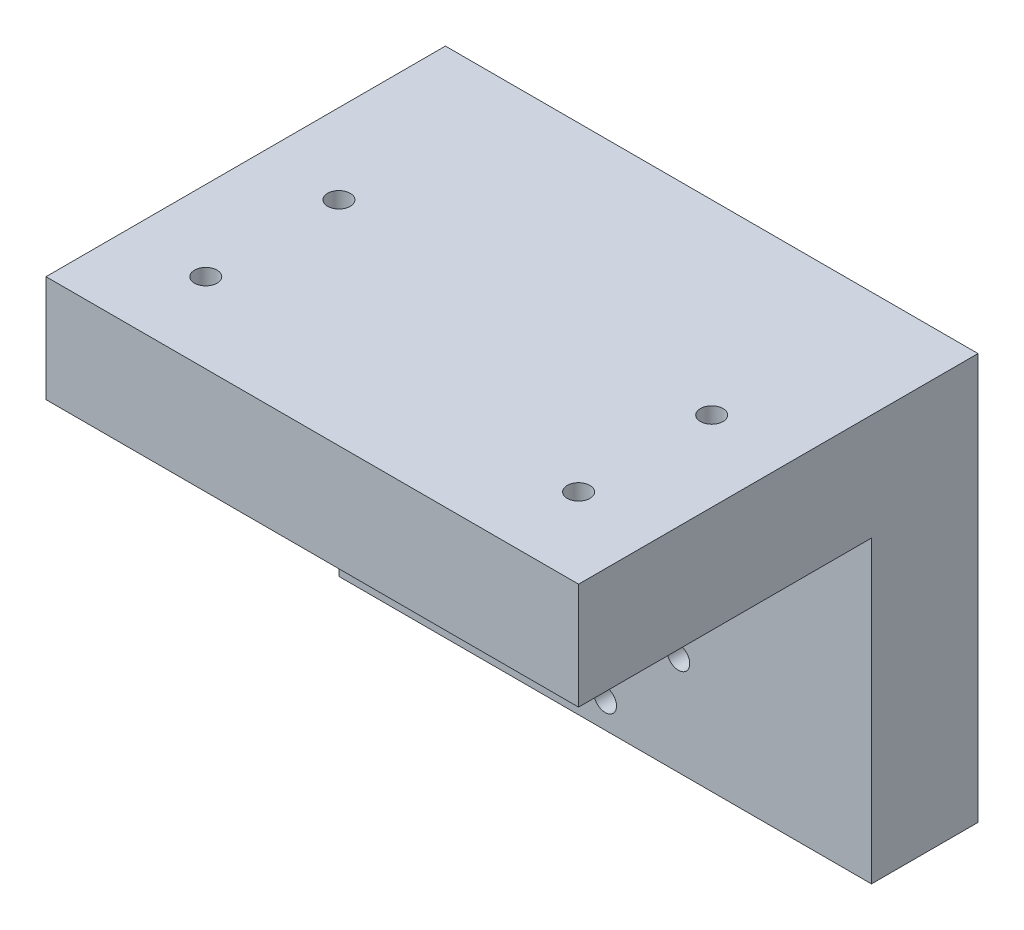
ISO-10303-21;
HEADER;
FILE_DESCRIPTION(('STEP AP214'),'2;1');
FILE_NAME('part.step','',(''),(''),'','','');
FILE_SCHEMA(('AUTOMOTIVE_DESIGN { 1 0 10303 214 1 1 1 1 }'));
ENDSEC;
DATA;
#1=APPLICATION_CONTEXT('core data for automotive mechanical design processes');
#2=APPLICATION_PROTOCOL_DEFINITION('international standard','automotive_design',2000,#1);
#3=PRODUCT_CONTEXT('',#1,'mechanical');
#4=PRODUCT('Part','Part','',(#3));
#5=PRODUCT_RELATED_PRODUCT_CATEGORY('part','',(#4));
#6=PRODUCT_DEFINITION_FORMATION('','',#4);
#7=PRODUCT_DEFINITION_CONTEXT('part definition',#1,'design');
#8=PRODUCT_DEFINITION('design','',#6,#7);
#9=PRODUCT_DEFINITION_SHAPE('','',#8);
#10=(LENGTH_UNIT() NAMED_UNIT(*) SI_UNIT(.MILLI.,.METRE.));
#11=(NAMED_UNIT(*) PLANE_ANGLE_UNIT() SI_UNIT($,.RADIAN.));
#12=(NAMED_UNIT(*) SI_UNIT($,.STERADIAN.) SOLID_ANGLE_UNIT());
#13=UNCERTAINTY_MEASURE_WITH_UNIT(LENGTH_MEASURE(1.E-05),#10,'distance_accuracy_value','');
#14=(GEOMETRIC_REPRESENTATION_CONTEXT(3) GLOBAL_UNCERTAINTY_ASSIGNED_CONTEXT((#13)) GLOBAL_UNIT_ASSIGNED_CONTEXT((#10,
#11,#12)) REPRESENTATION_CONTEXT('',''));
#15=CARTESIAN_POINT('',(0.,0.,0.));
#16=DIRECTION('',(0.,0.,1.));
#17=DIRECTION('',(1.,0.,0.));
#18=AXIS2_PLACEMENT_3D('',#15,#16,#17);
#19=CARTESIAN_POINT('',(40.,-46.,2.));
#20=DIRECTION('',(0.,0.,1.));
#21=DIRECTION('',(1.,0.,0.));
#22=AXIS2_PLACEMENT_3D('',#19,#20,#21);
#23=PLANE('',#22);
#24=CARTESIAN_POINT('',(40.,-46.,2.));
#25=DIRECTION('',(0.,0.,1.));
#26=DIRECTION('',(1.,0.,0.));
#27=AXIS2_PLACEMENT_3D('',#24,#25,#26);
#28=CIRCLE('',#27,4.);
#29=CARTESIAN_POINT('',(44.,-46.,2.));
#30=VERTEX_POINT('',#29);
#31=EDGE_CURVE('E341',#30,#30,#28,.T.);
#32=ORIENTED_EDGE('',*,*,#31,.T.);
#33=EDGE_LOOP('',(#32));
#34=FACE_BOUND('',#33,.T.);
#35=CARTESIAN_POINT('',(40.,-46.,2.));
#36=DIRECTION('',(0.,0.,1.));
#37=DIRECTION('',(1.,0.,0.));
#38=AXIS2_PLACEMENT_3D('',#35,#36,#37);
#39=CIRCLE('',#38,9.1);
#40=CARTESIAN_POINT('',(49.1,-46.,2.));
#41=VERTEX_POINT('',#40);
#42=EDGE_CURVE('E42',#41,#41,#39,.T.);
#43=ORIENTED_EDGE('',*,*,#42,.F.);
#44=EDGE_LOOP('',(#43));
#45=FACE_BOUND('',#44,.T.);
#46=ADVANCED_FACE('F23',(#34,#45),#23,.F.);
#47=CARTESIAN_POINT('',(68.,1.,48.));
#48=DIRECTION('',(0.,-1.,0.));
#49=DIRECTION('',(0.,0.,-1.));
#50=AXIS2_PLACEMENT_3D('',#47,#48,#49);
#51=CYLINDRICAL_SURFACE('',#50,1.7);
#52=DIRECTION('',(0.,-1.,0.));
#53=VECTOR('',#52,1.);
#54=CARTESIAN_POINT('',(68.,1.,46.3));
#55=LINE('',#54,#53);
#56=CARTESIAN_POINT('',(68.,0.,46.3));
#57=VERTEX_POINT('',#56);
#58=CARTESIAN_POINT('',(68.,-16.,46.3));
#59=VERTEX_POINT('',#58);
#60=EDGE_CURVE('E12',#57,#59,#55,.T.);
#61=ORIENTED_EDGE('',*,*,#60,.F.);
#62=CARTESIAN_POINT('',(68.,0.,48.));
#63=DIRECTION('',(0.,-1.,0.));
#64=DIRECTION('',(0.,0.,-1.));
#65=AXIS2_PLACEMENT_3D('',#62,#63,#64);
#66=CIRCLE('',#65,1.7);
#67=EDGE_CURVE('E318',#57,#57,#66,.T.);
#68=ORIENTED_EDGE('',*,*,#67,.F.);
#69=ORIENTED_EDGE('',*,*,#60,.T.);
#70=CARTESIAN_POINT('',(68.,-16.,48.));
#71=DIRECTION('',(0.,-1.,0.));
#72=DIRECTION('',(0.,0.,-1.));
#73=AXIS2_PLACEMENT_3D('',#70,#71,#72);
#74=CIRCLE('',#73,1.7);
#75=EDGE_CURVE('E334',#59,#59,#74,.T.);
#76=ORIENTED_EDGE('',*,*,#75,.T.);
#77=EDGE_LOOP('',(#61,#68,#69,#76));
#78=FACE_BOUND('',#77,.T.);
#79=ADVANCED_FACE('F658',(#78),#51,.F.);
#80=CARTESIAN_POINT('',(68.,1.,28.));
#81=DIRECTION('',(0.,-1.,0.));
#82=DIRECTION('',(0.,0.,-1.));
#83=AXIS2_PLACEMENT_3D('',#80,#81,#82);
#84=CYLINDRICAL_SURFACE('',#83,1.7);
#85=DIRECTION('',(0.,-1.,0.));
#86=VECTOR('',#85,1.);
#87=CARTESIAN_POINT('',(68.,1.,26.3));
#88=LINE('',#87,#86);
#89=CARTESIAN_POINT('',(68.,0.,26.3));
#90=VERTEX_POINT('',#89);
#91=CARTESIAN_POINT('',(68.,-16.,26.3));
#92=VERTEX_POINT('',#91);
#93=EDGE_CURVE('E27',#90,#92,#88,.T.);
#94=ORIENTED_EDGE('',*,*,#93,.F.);
#95=CARTESIAN_POINT('',(68.,0.,28.));
#96=DIRECTION('',(0.,-1.,0.));
#97=DIRECTION('',(0.,0.,-1.));
#98=AXIS2_PLACEMENT_3D('',#95,#96,#97);
#99=CIRCLE('',#98,1.7);
#100=EDGE_CURVE('E314',#90,#90,#99,.T.);
#101=ORIENTED_EDGE('',*,*,#100,.F.);
#102=ORIENTED_EDGE('',*,*,#93,.T.);
#103=CARTESIAN_POINT('',(68.,-16.,28.));
#104=DIRECTION('',(0.,-1.,0.));
#105=DIRECTION('',(0.,0.,-1.));
#106=AXIS2_PLACEMENT_3D('',#103,#104,#105);
#107=CIRCLE('',#106,1.7);
#108=EDGE_CURVE('E328',#92,#92,#107,.T.);
#109=ORIENTED_EDGE('',*,*,#108,.T.);
#110=EDGE_LOOP('',(#94,#101,#102,#109));
#111=FACE_BOUND('',#110,.T.);
#112=ADVANCED_FACE('F647',(#111),#84,.F.);
#113=CARTESIAN_POINT('',(12.,1.,48.));
#114=DIRECTION('',(0.,-1.,0.));
#115=DIRECTION('',(0.,0.,-1.));
#116=AXIS2_PLACEMENT_3D('',#113,#114,#115);
#117=CYLINDRICAL_SURFACE('',#116,1.7);
#118=DIRECTION('',(0.,-1.,0.));
#119=VECTOR('',#118,1.);
#120=CARTESIAN_POINT('',(12.,1.,46.3));
#121=LINE('',#120,#119);
#122=CARTESIAN_POINT('',(12.,0.,46.3));
#123=VERTEX_POINT('',#122);
#124=CARTESIAN_POINT('',(12.,-16.,46.3));
#125=VERTEX_POINT('',#124);
#126=EDGE_CURVE('E228',#123,#125,#121,.T.);
#127=ORIENTED_EDGE('',*,*,#126,.F.);
#128=CARTESIAN_POINT('',(12.,0.,48.));
#129=DIRECTION('',(0.,-1.,0.));
#130=DIRECTION('',(0.,0.,-1.));
#131=AXIS2_PLACEMENT_3D('',#128,#129,#130);
#132=CIRCLE('',#131,1.7);
#133=EDGE_CURVE('E309',#123,#123,#132,.T.);
#134=ORIENTED_EDGE('',*,*,#133,.F.);
#135=ORIENTED_EDGE('',*,*,#126,.T.);
#136=CARTESIAN_POINT('',(12.,-16.,48.));
#137=DIRECTION('',(0.,-1.,0.));
#138=DIRECTION('',(0.,0.,-1.));
#139=AXIS2_PLACEMENT_3D('',#136,#137,#138);
#140=CIRCLE('',#139,1.7);
#141=EDGE_CURVE('E246',#125,#125,#140,.T.);
#142=ORIENTED_EDGE('',*,*,#141,.T.);
#143=EDGE_LOOP('',(#127,#134,#135,#142));
#144=FACE_BOUND('',#143,.T.);
#145=ADVANCED_FACE('F610',(#144),#117,.F.);
#146=CARTESIAN_POINT('',(12.,1.,28.));
#147=DIRECTION('',(0.,-1.,0.));
#148=DIRECTION('',(0.,0.,-1.));
#149=AXIS2_PLACEMENT_3D('',#146,#147,#148);
#150=CYLINDRICAL_SURFACE('',#149,1.7);
#151=DIRECTION('',(0.,-1.,0.));
#152=VECTOR('',#151,1.);
#153=CARTESIAN_POINT('',(12.,1.,26.3));
#154=LINE('',#153,#152);
#155=CARTESIAN_POINT('',(12.,0.,26.3));
#156=VERTEX_POINT('',#155);
#157=CARTESIAN_POINT('',(12.,-16.,26.3));
#158=VERTEX_POINT('',#157);
#159=EDGE_CURVE('E235',#156,#158,#154,.T.);
#160=ORIENTED_EDGE('',*,*,#159,.F.);
#161=CARTESIAN_POINT('',(12.,0.,28.));
#162=DIRECTION('',(0.,-1.,0.));
#163=DIRECTION('',(0.,0.,-1.));
#164=AXIS2_PLACEMENT_3D('',#161,#162,#163);
#165=CIRCLE('',#164,1.7);
#166=EDGE_CURVE('E308',#156,#156,#165,.T.);
#167=ORIENTED_EDGE('',*,*,#166,.F.);
#168=ORIENTED_EDGE('',*,*,#159,.T.);
#169=CARTESIAN_POINT('',(12.,-16.,28.));
#170=DIRECTION('',(0.,-1.,0.));
#171=DIRECTION('',(0.,0.,-1.));
#172=AXIS2_PLACEMENT_3D('',#169,#170,#171);
#173=CIRCLE('',#172,1.7);
#174=EDGE_CURVE('E245',#158,#158,#173,.T.);
#175=ORIENTED_EDGE('',*,*,#174,.T.);
#176=EDGE_LOOP('',(#160,#167,#168,#175));
#177=FACE_BOUND('',#176,.T.);
#178=ADVANCED_FACE('F605',(#177),#150,.F.);
#179=CARTESIAN_POINT('',(40.,-46.,0.));
#180=DIRECTION('',(0.,0.,1.));
#181=DIRECTION('',(1.,0.,0.));
#182=AXIS2_PLACEMENT_3D('',#179,#180,#181);
#183=CYLINDRICAL_SURFACE('',#182,9.1);
#184=DIRECTION('',(0.,0.,1.));
#185=VECTOR('',#184,1.);
#186=CARTESIAN_POINT('',(49.1,-46.,0.));
#187=LINE('',#186,#185);
#188=CARTESIAN_POINT('',(49.1,-46.,0.));
#189=VERTEX_POINT('',#188);
#190=EDGE_CURVE('E348',#189,#41,#187,.T.);
#191=ORIENTED_EDGE('',*,*,#190,.F.);
#192=CARTESIAN_POINT('',(40.,-46.,0.));
#193=DIRECTION('',(0.,0.,1.));
#194=DIRECTION('',(1.,0.,0.));
#195=AXIS2_PLACEMENT_3D('',#192,#193,#194);
#196=CIRCLE('',#195,9.1);
#197=EDGE_CURVE('E286',#189,#189,#196,.T.);
#198=ORIENTED_EDGE('',*,*,#197,.F.);
#199=ORIENTED_EDGE('',*,*,#190,.T.);
#200=ORIENTED_EDGE('',*,*,#42,.T.);
#201=EDGE_LOOP('',(#191,#198,#199,#200));
#202=FACE_BOUND('',#201,.T.);
#203=ADVANCED_FACE('F585',(#202),#183,.F.);
#204=CARTESIAN_POINT('',(40.,-35.,-1.));
#205=DIRECTION('',(0.,0.,1.));
#206=DIRECTION('',(1.,0.,0.));
#207=AXIS2_PLACEMENT_3D('',#204,#205,#206);
#208=CYLINDRICAL_SURFACE('',#207,1.7);
#209=DIRECTION('',(0.,0.,1.));
#210=VECTOR('',#209,1.);
#211=CARTESIAN_POINT('',(41.7,-35.,-1.));
#212=LINE('',#211,#210);
#213=CARTESIAN_POINT('',(41.7,-35.,0.));
#214=VERTEX_POINT('',#213);
#215=CARTESIAN_POINT('',(41.7,-35.,16.));
#216=VERTEX_POINT('',#215);
#217=EDGE_CURVE('E241',#214,#216,#212,.T.);
#218=ORIENTED_EDGE('',*,*,#217,.F.);
#219=CARTESIAN_POINT('',(40.,-35.,0.));
#220=DIRECTION('',(0.,0.,1.));
#221=DIRECTION('',(1.,0.,0.));
#222=AXIS2_PLACEMENT_3D('',#219,#220,#221);
#223=CIRCLE('',#222,1.7);
#224=EDGE_CURVE('E292',#214,#214,#223,.T.);
#225=ORIENTED_EDGE('',*,*,#224,.F.);
#226=ORIENTED_EDGE('',*,*,#217,.T.);
#227=CARTESIAN_POINT('',(40.,-35.,16.));
#228=DIRECTION('',(0.,0.,1.));
#229=DIRECTION('',(1.,0.,0.));
#230=AXIS2_PLACEMENT_3D('',#227,#228,#229);
#231=CIRCLE('',#230,1.7);
#232=EDGE_CURVE('E252',#216,#216,#231,.T.);
#233=ORIENTED_EDGE('',*,*,#232,.T.);
#234=EDGE_LOOP('',(#218,#225,#226,#233));
#235=FACE_BOUND('',#234,.T.);
#236=ADVANCED_FACE('F578',(#235),#208,.F.);
#237=CARTESIAN_POINT('',(51.,-46.,-1.));
#238=DIRECTION('',(0.,0.,1.));
#239=DIRECTION('',(1.,0.,0.));
#240=AXIS2_PLACEMENT_3D('',#237,#238,#239);
#241=CYLINDRICAL_SURFACE('',#240,1.7);
#242=DIRECTION('',(0.,0.,1.));
#243=VECTOR('',#242,1.);
#244=CARTESIAN_POINT('',(52.7,-46.,-1.));
#245=LINE('',#244,#243);
#246=CARTESIAN_POINT('',(52.7,-46.,0.));
#247=VERTEX_POINT('',#246);
#248=CARTESIAN_POINT('',(52.7,-46.,16.));
#249=VERTEX_POINT('',#248);
#250=EDGE_CURVE('E238',#247,#249,#245,.T.);
#251=ORIENTED_EDGE('',*,*,#250,.F.);
#252=CARTESIAN_POINT('',(51.,-46.,0.));
#253=DIRECTION('',(0.,0.,1.));
#254=DIRECTION('',(1.,0.,0.));
#255=AXIS2_PLACEMENT_3D('',#252,#253,#254);
#256=CIRCLE('',#255,1.7);
#257=EDGE_CURVE('E287',#247,#247,#256,.T.);
#258=ORIENTED_EDGE('',*,*,#257,.F.);
#259=ORIENTED_EDGE('',*,*,#250,.T.);
#260=CARTESIAN_POINT('',(51.,-46.,16.));
#261=DIRECTION('',(0.,0.,1.));
#262=DIRECTION('',(1.,0.,0.));
#263=AXIS2_PLACEMENT_3D('',#260,#261,#262);
#264=CIRCLE('',#263,1.7);
#265=EDGE_CURVE('E234',#249,#249,#264,.T.);
#266=ORIENTED_EDGE('',*,*,#265,.T.);
#267=EDGE_LOOP('',(#251,#258,#259,#266));
#268=FACE_BOUND('',#267,.T.);
#269=ADVANCED_FACE('F581',(#268),#241,.F.);
#270=CARTESIAN_POINT('',(40.,-46.,-1.));
#271=DIRECTION('',(0.,0.,1.));
#272=DIRECTION('',(1.,0.,0.));
#273=AXIS2_PLACEMENT_3D('',#270,#271,#272);
#274=CYLINDRICAL_SURFACE('',#273,4.);
#275=ORIENTED_EDGE('',*,*,#31,.F.);
#276=DIRECTION('',(0.,0.,1.));
#277=VECTOR('',#276,1.);
#278=CARTESIAN_POINT('',(44.,-46.,-1.));
#279=LINE('',#278,#277);
#280=CARTESIAN_POINT('',(44.,-46.,16.));
#281=VERTEX_POINT('',#280);
#282=EDGE_CURVE('E52',#30,#281,#279,.T.);
#283=ORIENTED_EDGE('',*,*,#282,.T.);
#284=CARTESIAN_POINT('',(40.,-46.,16.));
#285=DIRECTION('',(0.,0.,1.));
#286=DIRECTION('',(1.,0.,0.));
#287=AXIS2_PLACEMENT_3D('',#284,#285,#286);
#288=CIRCLE('',#287,4.);
#289=EDGE_CURVE('E233',#281,#281,#288,.T.);
#290=ORIENTED_EDGE('',*,*,#289,.T.);
#291=ORIENTED_EDGE('',*,*,#282,.F.);
#292=EDGE_LOOP('',(#275,#283,#290,#291));
#293=FACE_BOUND('',#292,.T.);
#294=ADVANCED_FACE('F620',(#293),#274,.F.);
#295=CARTESIAN_POINT('',(29.,-46.,-1.));
#296=DIRECTION('',(0.,0.,1.));
#297=DIRECTION('',(1.,0.,0.));
#298=AXIS2_PLACEMENT_3D('',#295,#296,#297);
#299=CYLINDRICAL_SURFACE('',#298,1.7);
#300=DIRECTION('',(0.,0.,1.));
#301=VECTOR('',#300,1.);
#302=CARTESIAN_POINT('',(30.7,-46.,-1.));
#303=LINE('',#302,#301);
#304=CARTESIAN_POINT('',(30.7,-46.,0.));
#305=VERTEX_POINT('',#304);
#306=CARTESIAN_POINT('',(30.7,-46.,16.));
#307=VERTEX_POINT('',#306);
#308=EDGE_CURVE('E339',#305,#307,#303,.T.);
#309=ORIENTED_EDGE('',*,*,#308,.F.);
#310=CARTESIAN_POINT('',(29.,-46.,0.));
#311=DIRECTION('',(0.,0.,1.));
#312=DIRECTION('',(1.,0.,0.));
#313=AXIS2_PLACEMENT_3D('',#310,#311,#312);
#314=CIRCLE('',#313,1.7);
#315=EDGE_CURVE('E282',#305,#305,#314,.T.);
#316=ORIENTED_EDGE('',*,*,#315,.F.);
#317=ORIENTED_EDGE('',*,*,#308,.T.);
#318=CARTESIAN_POINT('',(29.,-46.,16.));
#319=DIRECTION('',(0.,0.,1.));
#320=DIRECTION('',(1.,0.,0.));
#321=AXIS2_PLACEMENT_3D('',#318,#319,#320);
#322=CIRCLE('',#321,1.7);
#323=EDGE_CURVE('E240',#307,#307,#322,.T.);
#324=ORIENTED_EDGE('',*,*,#323,.T.);
#325=EDGE_LOOP('',(#309,#316,#317,#324));
#326=FACE_BOUND('',#325,.T.);
#327=ADVANCED_FACE('F594',(#326),#299,.F.);
#328=CARTESIAN_POINT('',(40.,-57.,-1.));
#329=DIRECTION('',(0.,0.,1.));
#330=DIRECTION('',(1.,0.,0.));
#331=AXIS2_PLACEMENT_3D('',#328,#329,#330);
#332=CYLINDRICAL_SURFACE('',#331,1.7);
#333=DIRECTION('',(0.,0.,1.));
#334=VECTOR('',#333,1.);
#335=CARTESIAN_POINT('',(41.7,-57.,-1.));
#336=LINE('',#335,#334);
#337=CARTESIAN_POINT('',(41.7,-57.,0.));
#338=VERTEX_POINT('',#337);
#339=CARTESIAN_POINT('',(41.7,-57.,16.));
#340=VERTEX_POINT('',#339);
#341=EDGE_CURVE('E337',#338,#340,#336,.T.);
#342=ORIENTED_EDGE('',*,*,#341,.F.);
#343=CARTESIAN_POINT('',(40.,-57.,0.));
#344=DIRECTION('',(0.,0.,1.));
#345=DIRECTION('',(1.,0.,0.));
#346=AXIS2_PLACEMENT_3D('',#343,#344,#345);
#347=CIRCLE('',#346,1.7);
#348=EDGE_CURVE('E279',#338,#338,#347,.T.);
#349=ORIENTED_EDGE('',*,*,#348,.F.);
#350=ORIENTED_EDGE('',*,*,#341,.T.);
#351=CARTESIAN_POINT('',(40.,-57.,16.));
#352=DIRECTION('',(0.,0.,1.));
#353=DIRECTION('',(1.,0.,0.));
#354=AXIS2_PLACEMENT_3D('',#351,#352,#353);
#355=CIRCLE('',#354,1.7);
#356=EDGE_CURVE('E190',#340,#340,#355,.T.);
#357=ORIENTED_EDGE('',*,*,#356,.T.);
#358=EDGE_LOOP('',(#342,#349,#350,#357));
#359=FACE_BOUND('',#358,.T.);
#360=ADVANCED_FACE('F532',(#359),#332,.F.);
#361=CARTESIAN_POINT('',(80.,-61.,0.));
#362=DIRECTION('',(1.,0.,0.));
#363=DIRECTION('',(0.,1.,0.));
#364=AXIS2_PLACEMENT_3D('',#361,#362,#363);
#365=PLANE('',#364);
#366=DIRECTION('',(0.,1.,0.));
#367=VECTOR('',#366,1.);
#368=CARTESIAN_POINT('',(80.,-61.,16.));
#369=LINE('',#368,#367);
#370=CARTESIAN_POINT('',(80.,-61.,16.));
#371=VERTEX_POINT('',#370);
#372=CARTESIAN_POINT('',(80.,-16.,16.));
#373=VERTEX_POINT('',#372);
#374=EDGE_CURVE('E183',#371,#373,#369,.T.);
#375=ORIENTED_EDGE('',*,*,#374,.F.);
#376=DIRECTION('',(0.,0.,1.));
#377=VECTOR('',#376,1.);
#378=CARTESIAN_POINT('',(80.,-61.,0.));
#379=LINE('',#378,#377);
#380=CARTESIAN_POINT('',(80.,-61.,0.));
#381=VERTEX_POINT('',#380);
#382=EDGE_CURVE('E219',#381,#371,#379,.T.);
#383=ORIENTED_EDGE('',*,*,#382,.F.);
#384=DIRECTION('',(0.,-1.,0.));
#385=VECTOR('',#384,1.);
#386=CARTESIAN_POINT('',(80.,0.,0.));
#387=LINE('',#386,#385);
#388=CARTESIAN_POINT('',(80.,0.,0.));
#389=VERTEX_POINT('',#388);
#390=EDGE_CURVE('E274',#389,#381,#387,.T.);
#391=ORIENTED_EDGE('',*,*,#390,.F.);
#392=DIRECTION('',(0.,0.,1.));
#393=VECTOR('',#392,1.);
#394=CARTESIAN_POINT('',(80.,0.,0.));
#395=LINE('',#394,#393);
#396=CARTESIAN_POINT('',(80.,0.,60.));
#397=VERTEX_POINT('',#396);
#398=EDGE_CURVE('E305',#389,#397,#395,.T.);
#399=ORIENTED_EDGE('',*,*,#398,.T.);
#400=DIRECTION('',(0.,1.,0.));
#401=VECTOR('',#400,1.);
#402=CARTESIAN_POINT('',(80.,-16.,60.));
#403=LINE('',#402,#401);
#404=CARTESIAN_POINT('',(80.,-16.,60.));
#405=VERTEX_POINT('',#404);
#406=EDGE_CURVE('E265',#405,#397,#403,.T.);
#407=ORIENTED_EDGE('',*,*,#406,.F.);
#408=DIRECTION('',(0.,0.,1.));
#409=VECTOR('',#408,1.);
#410=CARTESIAN_POINT('',(80.,-16.,0.));
#411=LINE('',#410,#409);
#412=EDGE_CURVE('E250',#373,#405,#411,.T.);
#413=ORIENTED_EDGE('',*,*,#412,.F.);
#414=EDGE_LOOP('',(#375,#383,#391,#399,#407,#413));
#415=FACE_BOUND('',#414,.T.);
#416=ADVANCED_FACE('F512',(#415),#365,.T.);
#417=CARTESIAN_POINT('',(0.,-16.,0.));
#418=DIRECTION('',(0.,1.,0.));
#419=DIRECTION('',(1.,0.,0.));
#420=AXIS2_PLACEMENT_3D('',#417,#418,#419);
#421=PLANE('',#420);
#422=ORIENTED_EDGE('',*,*,#75,.F.);
#423=EDGE_LOOP('',(#422));
#424=FACE_BOUND('',#423,.T.);
#425=ORIENTED_EDGE('',*,*,#108,.F.);
#426=EDGE_LOOP('',(#425));
#427=FACE_BOUND('',#426,.T.);
#428=ORIENTED_EDGE('',*,*,#141,.F.);
#429=EDGE_LOOP('',(#428));
#430=FACE_BOUND('',#429,.T.);
#431=ORIENTED_EDGE('',*,*,#174,.F.);
#432=EDGE_LOOP('',(#431));
#433=FACE_BOUND('',#432,.T.);
#434=DIRECTION('',(1.,0.,0.));
#435=VECTOR('',#434,1.);
#436=CARTESIAN_POINT('',(0.,-16.,60.));
#437=LINE('',#436,#435);
#438=CARTESIAN_POINT('',(0.,-16.,60.));
#439=VERTEX_POINT('',#438);
#440=EDGE_CURVE('E205',#439,#405,#437,.T.);
#441=ORIENTED_EDGE('',*,*,#440,.F.);
#442=DIRECTION('',(0.,0.,1.));
#443=VECTOR('',#442,1.);
#444=CARTESIAN_POINT('',(0.,-16.,0.));
#445=LINE('',#444,#443);
#446=CARTESIAN_POINT('',(0.,-16.,16.));
#447=VERTEX_POINT('',#446);
#448=EDGE_CURVE('E193',#447,#439,#445,.T.);
#449=ORIENTED_EDGE('',*,*,#448,.F.);
#450=DIRECTION('',(-1.,0.,0.));
#451=VECTOR('',#450,1.);
#452=CARTESIAN_POINT('',(0.,-16.,16.));
#453=LINE('',#452,#451);
#454=EDGE_CURVE('E176',#373,#447,#453,.T.);
#455=ORIENTED_EDGE('',*,*,#454,.F.);
#456=ORIENTED_EDGE('',*,*,#412,.T.);
#457=EDGE_LOOP('',(#441,#449,#455,#456));
#458=FACE_BOUND('',#457,.T.);
#459=ADVANCED_FACE('F199',(#424,#427,#430,#433,#458),#421,.F.);
#460=CARTESIAN_POINT('',(0.,-16.,60.));
#461=DIRECTION('',(0.,0.,1.));
#462=DIRECTION('',(1.,0.,0.));
#463=AXIS2_PLACEMENT_3D('',#460,#461,#462);
#464=PLANE('',#463);
#465=DIRECTION('',(0.,1.,0.));
#466=VECTOR('',#465,1.);
#467=CARTESIAN_POINT('',(0.,-16.,60.));
#468=LINE('',#467,#466);
#469=CARTESIAN_POINT('',(0.,0.,60.));
#470=VERTEX_POINT('',#469);
#471=EDGE_CURVE('E202',#439,#470,#468,.T.);
#472=ORIENTED_EDGE('',*,*,#471,.F.);
#473=ORIENTED_EDGE('',*,*,#440,.T.);
#474=ORIENTED_EDGE('',*,*,#406,.T.);
#475=DIRECTION('',(1.,0.,0.));
#476=VECTOR('',#475,1.);
#477=CARTESIAN_POINT('',(0.,0.,60.));
#478=LINE('',#477,#476);
#479=EDGE_CURVE('E297',#470,#397,#478,.T.);
#480=ORIENTED_EDGE('',*,*,#479,.F.);
#481=EDGE_LOOP('',(#472,#473,#474,#480));
#482=FACE_BOUND('',#481,.T.);
#483=ADVANCED_FACE('F513',(#482),#464,.T.);
#484=CARTESIAN_POINT('',(0.,0.,0.));
#485=DIRECTION('',(0.,1.,0.));
#486=DIRECTION('',(1.,0.,0.));
#487=AXIS2_PLACEMENT_3D('',#484,#485,#486);
#488=PLANE('',#487);
#489=ORIENTED_EDGE('',*,*,#67,.T.);
#490=EDGE_LOOP('',(#489));
#491=FACE_BOUND('',#490,.T.);
#492=ORIENTED_EDGE('',*,*,#100,.T.);
#493=EDGE_LOOP('',(#492));
#494=FACE_BOUND('',#493,.T.);
#495=ORIENTED_EDGE('',*,*,#133,.T.);
#496=EDGE_LOOP('',(#495));
#497=FACE_BOUND('',#496,.T.);
#498=ORIENTED_EDGE('',*,*,#166,.T.);
#499=EDGE_LOOP('',(#498));
#500=FACE_BOUND('',#499,.T.);
#501=DIRECTION('',(1.,0.,0.));
#502=VECTOR('',#501,1.);
#503=CARTESIAN_POINT('',(0.,0.,0.));
#504=LINE('',#503,#502);
#505=CARTESIAN_POINT('',(0.,0.,0.));
#506=VERTEX_POINT('',#505);
#507=EDGE_CURVE('E218',#506,#389,#504,.T.);
#508=ORIENTED_EDGE('',*,*,#507,.F.);
#509=DIRECTION('',(0.,0.,-1.));
#510=VECTOR('',#509,1.);
#511=CARTESIAN_POINT('',(0.,0.,60.));
#512=LINE('',#511,#510);
#513=EDGE_CURVE('E211',#470,#506,#512,.T.);
#514=ORIENTED_EDGE('',*,*,#513,.F.);
#515=ORIENTED_EDGE('',*,*,#479,.T.);
#516=ORIENTED_EDGE('',*,*,#398,.F.);
#517=EDGE_LOOP('',(#508,#514,#515,#516));
#518=FACE_BOUND('',#517,.T.);
#519=ADVANCED_FACE('F553',(#491,#494,#497,#500,#518),#488,.T.);
#520=CARTESIAN_POINT('',(0.,-61.,0.));
#521=DIRECTION('',(0.,0.,1.));
#522=DIRECTION('',(1.,0.,0.));
#523=AXIS2_PLACEMENT_3D('',#520,#521,#522);
#524=PLANE('',#523);
#525=ORIENTED_EDGE('',*,*,#224,.T.);
#526=EDGE_LOOP('',(#525));
#527=FACE_BOUND('',#526,.T.);
#528=ORIENTED_EDGE('',*,*,#257,.T.);
#529=EDGE_LOOP('',(#528));
#530=FACE_BOUND('',#529,.T.);
#531=ORIENTED_EDGE('',*,*,#197,.T.);
#532=EDGE_LOOP('',(#531));
#533=FACE_BOUND('',#532,.T.);
#534=ORIENTED_EDGE('',*,*,#315,.T.);
#535=EDGE_LOOP('',(#534));
#536=FACE_BOUND('',#535,.T.);
#537=ORIENTED_EDGE('',*,*,#348,.T.);
#538=EDGE_LOOP('',(#537));
#539=FACE_BOUND('',#538,.T.);
#540=DIRECTION('',(0.,-1.,0.));
#541=VECTOR('',#540,1.);
#542=CARTESIAN_POINT('',(0.,0.,0.));
#543=LINE('',#542,#541);
#544=CARTESIAN_POINT('',(0.,-61.,0.));
#545=VERTEX_POINT('',#544);
#546=EDGE_CURVE('E221',#506,#545,#543,.T.);
#547=ORIENTED_EDGE('',*,*,#546,.F.);
#548=ORIENTED_EDGE('',*,*,#507,.T.);
#549=ORIENTED_EDGE('',*,*,#390,.T.);
#550=DIRECTION('',(1.,0.,0.));
#551=VECTOR('',#550,1.);
#552=CARTESIAN_POINT('',(0.,-61.,0.));
#553=LINE('',#552,#551);
#554=EDGE_CURVE('E214',#545,#381,#553,.T.);
#555=ORIENTED_EDGE('',*,*,#554,.F.);
#556=EDGE_LOOP('',(#547,#548,#549,#555));
#557=FACE_BOUND('',#556,.T.);
#558=ADVANCED_FACE('F544',(#527,#530,#533,#536,#539,#557),#524,.F.);
#559=CARTESIAN_POINT('',(0.,-61.,0.));
#560=DIRECTION('',(0.,1.,0.));
#561=DIRECTION('',(1.,0.,0.));
#562=AXIS2_PLACEMENT_3D('',#559,#560,#561);
#563=PLANE('',#562);
#564=ORIENTED_EDGE('',*,*,#382,.T.);
#565=DIRECTION('',(1.,0.,0.));
#566=VECTOR('',#565,1.);
#567=CARTESIAN_POINT('',(0.,-61.,16.));
#568=LINE('',#567,#566);
#569=CARTESIAN_POINT('',(0.,-61.,16.));
#570=VERTEX_POINT('',#569);
#571=EDGE_CURVE('E196',#570,#371,#568,.T.);
#572=ORIENTED_EDGE('',*,*,#571,.F.);
#573=DIRECTION('',(0.,0.,1.));
#574=VECTOR('',#573,1.);
#575=CARTESIAN_POINT('',(0.,-61.,0.));
#576=LINE('',#575,#574);
#577=EDGE_CURVE('E198',#545,#570,#576,.T.);
#578=ORIENTED_EDGE('',*,*,#577,.F.);
#579=ORIENTED_EDGE('',*,*,#554,.T.);
#580=EDGE_LOOP('',(#564,#572,#578,#579));
#581=FACE_BOUND('',#580,.T.);
#582=ADVANCED_FACE('F524',(#581),#563,.F.);
#583=CARTESIAN_POINT('',(0.,-61.,16.));
#584=DIRECTION('',(0.,0.,1.));
#585=DIRECTION('',(1.,0.,0.));
#586=AXIS2_PLACEMENT_3D('',#583,#584,#585);
#587=PLANE('',#586);
#588=ORIENTED_EDGE('',*,*,#232,.F.);
#589=EDGE_LOOP('',(#588));
#590=FACE_BOUND('',#589,.T.);
#591=ORIENTED_EDGE('',*,*,#265,.F.);
#592=EDGE_LOOP('',(#591));
#593=FACE_BOUND('',#592,.T.);
#594=ORIENTED_EDGE('',*,*,#289,.F.);
#595=EDGE_LOOP('',(#594));
#596=FACE_BOUND('',#595,.T.);
#597=ORIENTED_EDGE('',*,*,#323,.F.);
#598=EDGE_LOOP('',(#597));
#599=FACE_BOUND('',#598,.T.);
#600=ORIENTED_EDGE('',*,*,#356,.F.);
#601=EDGE_LOOP('',(#600));
#602=FACE_BOUND('',#601,.T.);
#603=DIRECTION('',(0.,1.,0.));
#604=VECTOR('',#603,1.);
#605=CARTESIAN_POINT('',(0.,-61.,16.));
#606=LINE('',#605,#604);
#607=EDGE_CURVE('E179',#570,#447,#606,.T.);
#608=ORIENTED_EDGE('',*,*,#607,.F.);
#609=ORIENTED_EDGE('',*,*,#571,.T.);
#610=ORIENTED_EDGE('',*,*,#374,.T.);
#611=ORIENTED_EDGE('',*,*,#454,.T.);
#612=EDGE_LOOP('',(#608,#609,#610,#611));
#613=FACE_BOUND('',#612,.T.);
#614=ADVANCED_FACE('F178',(#590,#593,#596,#599,#602,#613),#587,.T.);
#615=CARTESIAN_POINT('',(0.,-61.,0.));
#616=DIRECTION('',(1.,0.,0.));
#617=DIRECTION('',(0.,1.,0.));
#618=AXIS2_PLACEMENT_3D('',#615,#616,#617);
#619=PLANE('',#618);
#620=ORIENTED_EDGE('',*,*,#448,.T.);
#621=ORIENTED_EDGE('',*,*,#471,.T.);
#622=ORIENTED_EDGE('',*,*,#513,.T.);
#623=ORIENTED_EDGE('',*,*,#546,.T.);
#624=ORIENTED_EDGE('',*,*,#577,.T.);
#625=ORIENTED_EDGE('',*,*,#607,.T.);
#626=EDGE_LOOP('',(#620,#621,#622,#623,#624,#625));
#627=FACE_BOUND('',#626,.T.);
#628=ADVANCED_FACE('F191',(#627),#619,.F.);
#629=CLOSED_SHELL('',(#46,#79,#112,#145,#178,#203,#236,#269,#294,#327,#360,#416,#459,#483,#519,
#558,#582,#614,#628));
#630=MANIFOLD_SOLID_BREP('B1',#629);
#631=ADVANCED_BREP_SHAPE_REPRESENTATION('',(#18,#630),#14);
#632=SHAPE_DEFINITION_REPRESENTATION(#9,#631);
ENDSEC;
END-ISO-10303-21;
